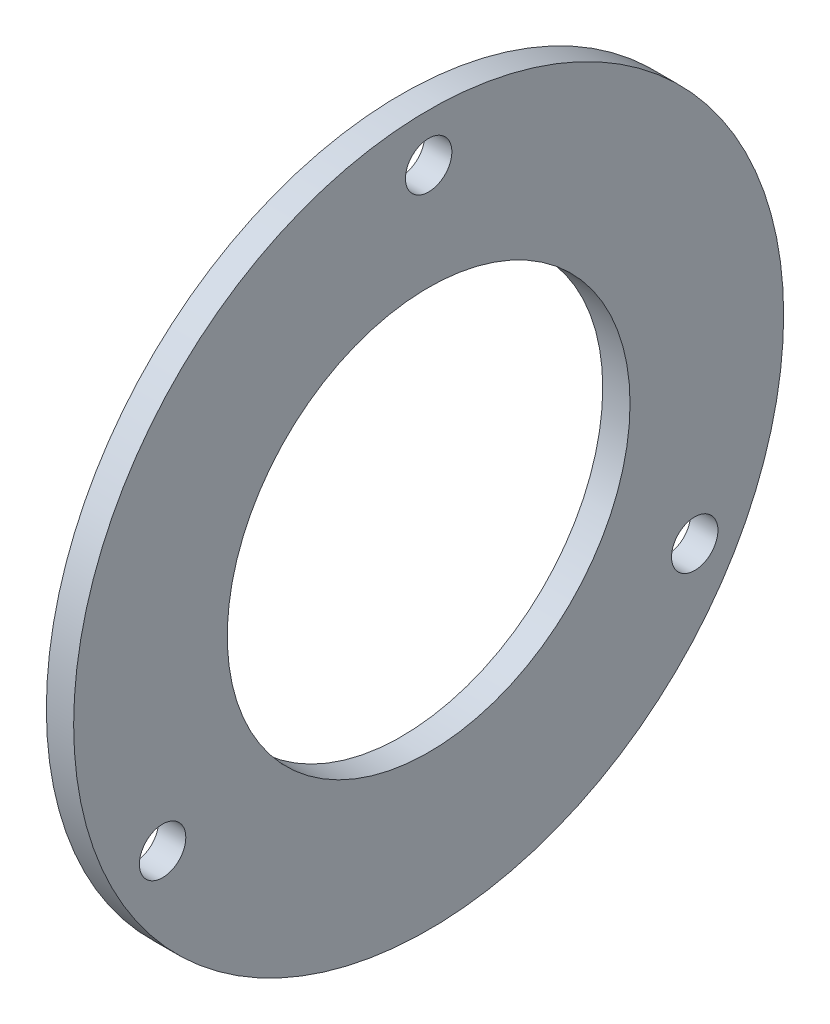
ISO-10303-21;
HEADER;
FILE_DESCRIPTION(('STEP AP214'),'2;1');
FILE_NAME('part.step','',(''),(''),'','','');
FILE_SCHEMA(('AUTOMOTIVE_DESIGN { 1 0 10303 214 1 1 1 1 }'));
ENDSEC;
DATA;
#1=APPLICATION_CONTEXT('core data for automotive mechanical design processes');
#2=APPLICATION_PROTOCOL_DEFINITION('international standard','automotive_design',2000,#1);
#3=PRODUCT_CONTEXT('',#1,'mechanical');
#4=PRODUCT('Part','Part','',(#3));
#5=PRODUCT_RELATED_PRODUCT_CATEGORY('part','',(#4));
#6=PRODUCT_DEFINITION_FORMATION('','',#4);
#7=PRODUCT_DEFINITION_CONTEXT('part definition',#1,'design');
#8=PRODUCT_DEFINITION('design','',#6,#7);
#9=PRODUCT_DEFINITION_SHAPE('','',#8);
#10=(LENGTH_UNIT() NAMED_UNIT(*) SI_UNIT(.MILLI.,.METRE.));
#11=(NAMED_UNIT(*) PLANE_ANGLE_UNIT() SI_UNIT($,.RADIAN.));
#12=(NAMED_UNIT(*) SI_UNIT($,.STERADIAN.) SOLID_ANGLE_UNIT());
#13=UNCERTAINTY_MEASURE_WITH_UNIT(LENGTH_MEASURE(1.E-05),#10,'distance_accuracy_value','');
#14=(GEOMETRIC_REPRESENTATION_CONTEXT(3) GLOBAL_UNCERTAINTY_ASSIGNED_CONTEXT((#13)) GLOBAL_UNIT_ASSIGNED_CONTEXT((#10,
#11,#12)) REPRESENTATION_CONTEXT('',''));
#15=CARTESIAN_POINT('',(0.,0.,0.));
#16=DIRECTION('',(0.,0.,1.));
#17=DIRECTION('',(1.,0.,0.));
#18=AXIS2_PLACEMENT_3D('',#15,#16,#17);
#19=CARTESIAN_POINT('',(2.,0.,0.));
#20=DIRECTION('',(-1.,0.,0.));
#21=DIRECTION('',(0.,0.,1.));
#22=AXIS2_PLACEMENT_3D('',#19,#20,#21);
#23=CYLINDRICAL_SURFACE('',#22,26.);
#24=CARTESIAN_POINT('',(2.,0.,0.));
#25=DIRECTION('',(1.,0.,0.));
#26=DIRECTION('',(0.,0.,-1.));
#27=AXIS2_PLACEMENT_3D('',#24,#25,#26);
#28=CIRCLE('',#27,26.);
#29=CARTESIAN_POINT('',(2.,0.,-26.));
#30=VERTEX_POINT('',#29);
#31=EDGE_CURVE('E10',#30,#30,#28,.T.);
#32=ORIENTED_EDGE('',*,*,#31,.F.);
#33=EDGE_LOOP('',(#32));
#34=FACE_BOUND('',#33,.T.);
#35=CARTESIAN_POINT('',(0.,0.,0.));
#36=DIRECTION('',(1.,0.,0.));
#37=DIRECTION('',(0.,0.,-1.));
#38=AXIS2_PLACEMENT_3D('',#35,#36,#37);
#39=CIRCLE('',#38,26.);
#40=CARTESIAN_POINT('',(0.,0.,-26.));
#41=VERTEX_POINT('',#40);
#42=EDGE_CURVE('E46',#41,#41,#39,.T.);
#43=ORIENTED_EDGE('',*,*,#42,.T.);
#44=EDGE_LOOP('',(#43));
#45=FACE_BOUND('',#44,.T.);
#46=ADVANCED_FACE('F43',(#34,#45),#23,.T.);
#47=CARTESIAN_POINT('',(2.,0.,0.));
#48=DIRECTION('',(1.,0.,0.));
#49=DIRECTION('',(0.,0.,-1.));
#50=AXIS2_PLACEMENT_3D('',#47,#48,#49);
#51=PLANE('',#50);
#52=CARTESIAN_POINT('',(2.,22.5,0.));
#53=DIRECTION('',(1.,0.,0.));
#54=DIRECTION('',(0.,0.,-1.));
#55=AXIS2_PLACEMENT_3D('',#52,#53,#54);
#56=CIRCLE('',#55,1.69999999999999);
#57=CARTESIAN_POINT('',(2.,22.5,-1.7));
#58=VERTEX_POINT('',#57);
#59=EDGE_CURVE('E81',#58,#58,#56,.T.);
#60=ORIENTED_EDGE('',*,*,#59,.F.);
#61=EDGE_LOOP('',(#60));
#62=FACE_BOUND('',#61,.T.);
#63=CARTESIAN_POINT('',(2.,-11.2500000000001,-19.4855715851498));
#64=DIRECTION('',(1.,0.,0.));
#65=DIRECTION('',(0.,0.,-1.));
#66=AXIS2_PLACEMENT_3D('',#63,#64,#65);
#67=CIRCLE('',#66,1.7);
#68=CARTESIAN_POINT('',(2.,-11.2500000000001,-21.1855715851498));
#69=VERTEX_POINT('',#68);
#70=EDGE_CURVE('E77',#69,#69,#67,.T.);
#71=ORIENTED_EDGE('',*,*,#70,.F.);
#72=EDGE_LOOP('',(#71));
#73=FACE_BOUND('',#72,.T.);
#74=CARTESIAN_POINT('',(2.,-11.2499999999998,19.48557158515));
#75=DIRECTION('',(1.,0.,0.));
#76=DIRECTION('',(0.,0.,-1.));
#77=AXIS2_PLACEMENT_3D('',#74,#75,#76);
#78=CIRCLE('',#77,1.7);
#79=CARTESIAN_POINT('',(2.,-11.2499999999998,17.78557158515));
#80=VERTEX_POINT('',#79);
#81=EDGE_CURVE('E69',#80,#80,#78,.T.);
#82=ORIENTED_EDGE('',*,*,#81,.F.);
#83=EDGE_LOOP('',(#82));
#84=FACE_BOUND('',#83,.T.);
#85=CARTESIAN_POINT('',(2.,0.,0.));
#86=DIRECTION('',(1.,0.,0.));
#87=DIRECTION('',(0.,0.,-1.));
#88=AXIS2_PLACEMENT_3D('',#85,#86,#87);
#89=CIRCLE('',#88,14.75);
#90=CARTESIAN_POINT('',(2.,0.,-14.75));
#91=VERTEX_POINT('',#90);
#92=EDGE_CURVE('E57',#91,#91,#89,.T.);
#93=ORIENTED_EDGE('',*,*,#92,.F.);
#94=EDGE_LOOP('',(#93));
#95=FACE_BOUND('',#94,.T.);
#96=ORIENTED_EDGE('',*,*,#31,.T.);
#97=EDGE_LOOP('',(#96));
#98=FACE_BOUND('',#97,.T.);
#99=ADVANCED_FACE('F99',(#62,#73,#84,#95,#98),#51,.T.);
#100=CARTESIAN_POINT('',(0.,0.,0.));
#101=DIRECTION('',(1.,0.,0.));
#102=DIRECTION('',(0.,0.,-1.));
#103=AXIS2_PLACEMENT_3D('',#100,#101,#102);
#104=PLANE('',#103);
#105=CARTESIAN_POINT('',(0.,22.5,0.));
#106=DIRECTION('',(1.,0.,0.));
#107=DIRECTION('',(0.,0.,-1.));
#108=AXIS2_PLACEMENT_3D('',#105,#106,#107);
#109=CIRCLE('',#108,1.69999999999999);
#110=CARTESIAN_POINT('',(0.,22.5,-1.7));
#111=VERTEX_POINT('',#110);
#112=EDGE_CURVE('E61',#111,#111,#109,.T.);
#113=ORIENTED_EDGE('',*,*,#112,.T.);
#114=EDGE_LOOP('',(#113));
#115=FACE_BOUND('',#114,.T.);
#116=CARTESIAN_POINT('',(0.,-11.2500000000001,-19.4855715851498));
#117=DIRECTION('',(1.,0.,0.));
#118=DIRECTION('',(0.,0.,-1.));
#119=AXIS2_PLACEMENT_3D('',#116,#117,#118);
#120=CIRCLE('',#119,1.7);
#121=CARTESIAN_POINT('',(0.,-11.2500000000001,-21.1855715851498));
#122=VERTEX_POINT('',#121);
#123=EDGE_CURVE('E73',#122,#122,#120,.T.);
#124=ORIENTED_EDGE('',*,*,#123,.T.);
#125=EDGE_LOOP('',(#124));
#126=FACE_BOUND('',#125,.T.);
#127=CARTESIAN_POINT('',(0.,-11.2499999999998,19.48557158515));
#128=DIRECTION('',(1.,0.,0.));
#129=DIRECTION('',(0.,0.,-1.));
#130=AXIS2_PLACEMENT_3D('',#127,#128,#129);
#131=CIRCLE('',#130,1.7);
#132=CARTESIAN_POINT('',(0.,-11.2499999999998,17.78557158515));
#133=VERTEX_POINT('',#132);
#134=EDGE_CURVE('E65',#133,#133,#131,.T.);
#135=ORIENTED_EDGE('',*,*,#134,.T.);
#136=EDGE_LOOP('',(#135));
#137=FACE_BOUND('',#136,.T.);
#138=CARTESIAN_POINT('',(0.,0.,0.));
#139=DIRECTION('',(1.,0.,0.));
#140=DIRECTION('',(0.,0.,-1.));
#141=AXIS2_PLACEMENT_3D('',#138,#139,#140);
#142=CIRCLE('',#141,14.75);
#143=CARTESIAN_POINT('',(0.,0.,-14.75));
#144=VERTEX_POINT('',#143);
#145=EDGE_CURVE('E55',#144,#144,#142,.T.);
#146=ORIENTED_EDGE('',*,*,#145,.T.);
#147=EDGE_LOOP('',(#146));
#148=FACE_BOUND('',#147,.T.);
#149=ORIENTED_EDGE('',*,*,#42,.F.);
#150=EDGE_LOOP('',(#149));
#151=FACE_BOUND('',#150,.T.);
#152=ADVANCED_FACE('F89',(#115,#126,#137,#148,#151),#104,.F.);
#153=CARTESIAN_POINT('',(0.,0.,0.));
#154=DIRECTION('',(1.,0.,0.));
#155=DIRECTION('',(0.,0.,-1.));
#156=AXIS2_PLACEMENT_3D('',#153,#154,#155);
#157=CYLINDRICAL_SURFACE('',#156,14.75);
#158=ORIENTED_EDGE('',*,*,#145,.F.);
#159=EDGE_LOOP('',(#158));
#160=FACE_BOUND('',#159,.T.);
#161=ORIENTED_EDGE('',*,*,#92,.T.);
#162=EDGE_LOOP('',(#161));
#163=FACE_BOUND('',#162,.T.);
#164=ADVANCED_FACE('F109',(#160,#163),#157,.F.);
#165=CARTESIAN_POINT('',(0.,-11.2499999999998,19.48557158515));
#166=DIRECTION('',(1.,0.,0.));
#167=DIRECTION('',(0.,0.,-1.));
#168=AXIS2_PLACEMENT_3D('',#165,#166,#167);
#169=CYLINDRICAL_SURFACE('',#168,1.7);
#170=ORIENTED_EDGE('',*,*,#134,.F.);
#171=EDGE_LOOP('',(#170));
#172=FACE_BOUND('',#171,.T.);
#173=ORIENTED_EDGE('',*,*,#81,.T.);
#174=EDGE_LOOP('',(#173));
#175=FACE_BOUND('',#174,.T.);
#176=ADVANCED_FACE('F111',(#172,#175),#169,.F.);
#177=CARTESIAN_POINT('',(0.,-11.2500000000001,-19.4855715851498));
#178=DIRECTION('',(1.,0.,0.));
#179=DIRECTION('',(0.,0.,-1.));
#180=AXIS2_PLACEMENT_3D('',#177,#178,#179);
#181=CYLINDRICAL_SURFACE('',#180,1.7);
#182=ORIENTED_EDGE('',*,*,#123,.F.);
#183=EDGE_LOOP('',(#182));
#184=FACE_BOUND('',#183,.T.);
#185=ORIENTED_EDGE('',*,*,#70,.T.);
#186=EDGE_LOOP('',(#185));
#187=FACE_BOUND('',#186,.T.);
#188=ADVANCED_FACE('F95',(#184,#187),#181,.F.);
#189=CARTESIAN_POINT('',(0.,22.5,0.));
#190=DIRECTION('',(1.,0.,0.));
#191=DIRECTION('',(0.,0.,-1.));
#192=AXIS2_PLACEMENT_3D('',#189,#190,#191);
#193=CYLINDRICAL_SURFACE('',#192,1.69999999999999);
#194=ORIENTED_EDGE('',*,*,#112,.F.);
#195=EDGE_LOOP('',(#194));
#196=FACE_BOUND('',#195,.T.);
#197=ORIENTED_EDGE('',*,*,#59,.T.);
#198=EDGE_LOOP('',(#197));
#199=FACE_BOUND('',#198,.T.);
#200=ADVANCED_FACE('F92',(#196,#199),#193,.F.);
#201=CLOSED_SHELL('',(#46,#99,#152,#164,#176,#188,#200));
#202=MANIFOLD_SOLID_BREP('B2',#201);
#203=ADVANCED_BREP_SHAPE_REPRESENTATION('',(#18,#202),#14);
#204=SHAPE_DEFINITION_REPRESENTATION(#9,#203);
ENDSEC;
END-ISO-10303-21;
